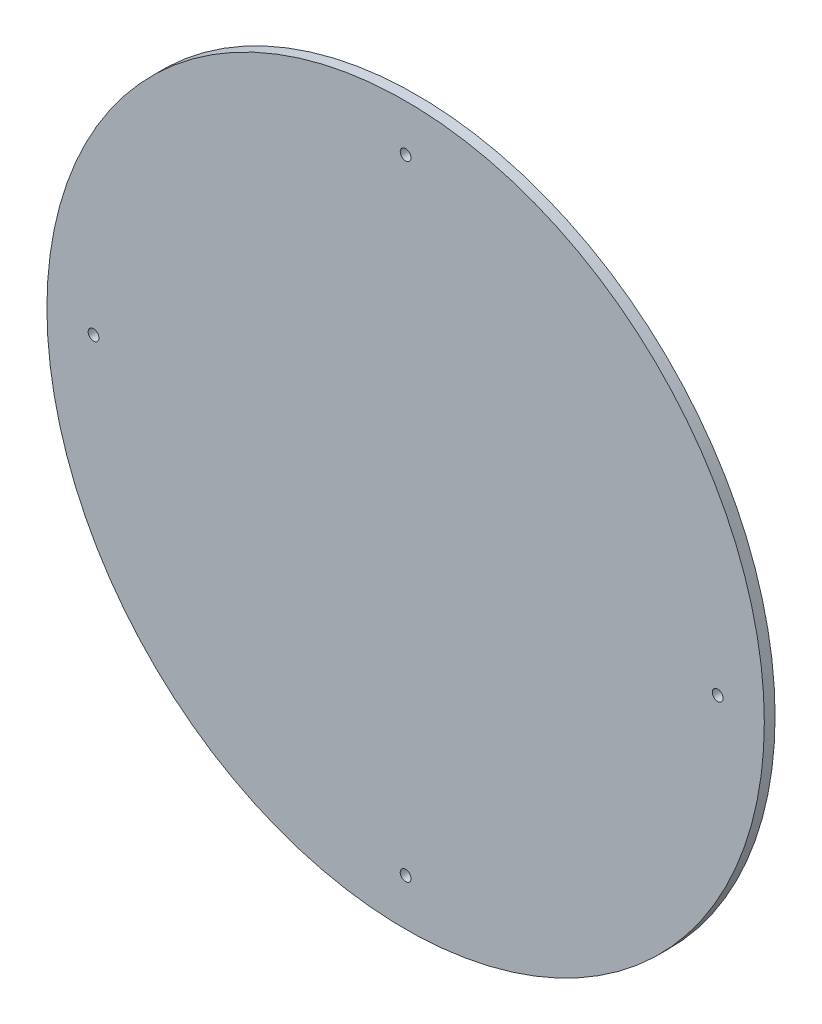
ISO-10303-21;
HEADER;
FILE_DESCRIPTION(('STEP AP214'),'2;1');
FILE_NAME('part.step','',(''),(''),'','','');
FILE_SCHEMA(('AUTOMOTIVE_DESIGN { 1 0 10303 214 1 1 1 1 }'));
ENDSEC;
DATA;
#1=APPLICATION_CONTEXT('core data for automotive mechanical design processes');
#2=APPLICATION_PROTOCOL_DEFINITION('international standard','automotive_design',2000,#1);
#3=PRODUCT_CONTEXT('',#1,'mechanical');
#4=PRODUCT('Part','Part','',(#3));
#5=PRODUCT_RELATED_PRODUCT_CATEGORY('part','',(#4));
#6=PRODUCT_DEFINITION_FORMATION('','',#4);
#7=PRODUCT_DEFINITION_CONTEXT('part definition',#1,'design');
#8=PRODUCT_DEFINITION('design','',#6,#7);
#9=PRODUCT_DEFINITION_SHAPE('','',#8);
#10=(LENGTH_UNIT() NAMED_UNIT(*) SI_UNIT(.MILLI.,.METRE.));
#11=(NAMED_UNIT(*) PLANE_ANGLE_UNIT() SI_UNIT($,.RADIAN.));
#12=(NAMED_UNIT(*) SI_UNIT($,.STERADIAN.) SOLID_ANGLE_UNIT());
#13=UNCERTAINTY_MEASURE_WITH_UNIT(LENGTH_MEASURE(1.E-05),#10,'distance_accuracy_value','');
#14=(GEOMETRIC_REPRESENTATION_CONTEXT(3) GLOBAL_UNCERTAINTY_ASSIGNED_CONTEXT((#13)) GLOBAL_UNIT_ASSIGNED_CONTEXT((#10,
#11,#12)) REPRESENTATION_CONTEXT('',''));
#15=CARTESIAN_POINT('',(0.,0.,0.));
#16=DIRECTION('',(0.,0.,1.));
#17=DIRECTION('',(1.,0.,0.));
#18=AXIS2_PLACEMENT_3D('',#15,#16,#17);
#19=CARTESIAN_POINT('',(0.,0.,3.));
#20=DIRECTION('',(0.,0.,-1.));
#21=DIRECTION('',(-1.,0.,0.));
#22=AXIS2_PLACEMENT_3D('',#19,#20,#21);
#23=CYLINDRICAL_SURFACE('',#22,100.);
#24=CARTESIAN_POINT('',(0.,0.,3.));
#25=DIRECTION('',(0.,0.,1.));
#26=DIRECTION('',(1.,0.,0.));
#27=AXIS2_PLACEMENT_3D('',#24,#25,#26);
#28=CIRCLE('',#27,100.);
#29=CARTESIAN_POINT('',(100.,0.,3.));
#30=VERTEX_POINT('',#29);
#31=EDGE_CURVE('E10',#30,#30,#28,.T.);
#32=ORIENTED_EDGE('',*,*,#31,.F.);
#33=EDGE_LOOP('',(#32));
#34=FACE_BOUND('',#33,.T.);
#35=CARTESIAN_POINT('',(0.,0.,0.));
#36=DIRECTION('',(0.,0.,1.));
#37=DIRECTION('',(1.,0.,0.));
#38=AXIS2_PLACEMENT_3D('',#35,#36,#37);
#39=CIRCLE('',#38,100.);
#40=CARTESIAN_POINT('',(100.,0.,0.));
#41=VERTEX_POINT('',#40);
#42=EDGE_CURVE('E40',#41,#41,#39,.T.);
#43=ORIENTED_EDGE('',*,*,#42,.T.);
#44=EDGE_LOOP('',(#43));
#45=FACE_BOUND('',#44,.T.);
#46=ADVANCED_FACE('F37',(#34,#45),#23,.T.);
#47=CARTESIAN_POINT('',(0.,0.,3.));
#48=DIRECTION('',(0.,0.,1.));
#49=DIRECTION('',(1.,0.,0.));
#50=AXIS2_PLACEMENT_3D('',#47,#48,#49);
#51=PLANE('',#50);
#52=CARTESIAN_POINT('',(0.,87.,3.));
#53=DIRECTION('',(0.,0.,1.));
#54=DIRECTION('',(1.,0.,0.));
#55=AXIS2_PLACEMENT_3D('',#52,#53,#54);
#56=CIRCLE('',#55,1.5);
#57=CARTESIAN_POINT('',(1.5,87.,3.));
#58=VERTEX_POINT('',#57);
#59=EDGE_CURVE('E72',#58,#58,#56,.T.);
#60=ORIENTED_EDGE('',*,*,#59,.F.);
#61=EDGE_LOOP('',(#60));
#62=FACE_BOUND('',#61,.T.);
#63=CARTESIAN_POINT('',(87.,0.,3.));
#64=DIRECTION('',(0.,0.,1.));
#65=DIRECTION('',(1.,0.,0.));
#66=AXIS2_PLACEMENT_3D('',#63,#64,#65);
#67=CIRCLE('',#66,1.50000000000029);
#68=CARTESIAN_POINT('',(88.5000000000003,0.,3.));
#69=VERTEX_POINT('',#68);
#70=EDGE_CURVE('E64',#69,#69,#67,.T.);
#71=ORIENTED_EDGE('',*,*,#70,.F.);
#72=EDGE_LOOP('',(#71));
#73=FACE_BOUND('',#72,.T.);
#74=CARTESIAN_POINT('',(0.,-87.,3.));
#75=DIRECTION('',(0.,0.,1.));
#76=DIRECTION('',(1.,0.,0.));
#77=AXIS2_PLACEMENT_3D('',#74,#75,#76);
#78=CIRCLE('',#77,1.50000000000057);
#79=CARTESIAN_POINT('',(1.50000000000056,-87.,3.));
#80=VERTEX_POINT('',#79);
#81=EDGE_CURVE('E55',#80,#80,#78,.T.);
#82=ORIENTED_EDGE('',*,*,#81,.F.);
#83=EDGE_LOOP('',(#82));
#84=FACE_BOUND('',#83,.T.);
#85=CARTESIAN_POINT('',(-87.,0.,3.));
#86=DIRECTION('',(0.,0.,1.));
#87=DIRECTION('',(1.,0.,0.));
#88=AXIS2_PLACEMENT_3D('',#85,#86,#87);
#89=CIRCLE('',#88,1.50000000000088);
#90=CARTESIAN_POINT('',(-85.4999999999991,0.,3.));
#91=VERTEX_POINT('',#90);
#92=EDGE_CURVE('E56',#91,#91,#89,.T.);
#93=ORIENTED_EDGE('',*,*,#92,.F.);
#94=EDGE_LOOP('',(#93));
#95=FACE_BOUND('',#94,.T.);
#96=ORIENTED_EDGE('',*,*,#31,.T.);
#97=EDGE_LOOP('',(#96));
#98=FACE_BOUND('',#97,.T.);
#99=ADVANCED_FACE('F85',(#62,#73,#84,#95,#98),#51,.T.);
#100=CARTESIAN_POINT('',(0.,0.,0.));
#101=DIRECTION('',(0.,0.,1.));
#102=DIRECTION('',(1.,0.,0.));
#103=AXIS2_PLACEMENT_3D('',#100,#101,#102);
#104=PLANE('',#103);
#105=CARTESIAN_POINT('',(0.,87.,0.));
#106=DIRECTION('',(0.,0.,1.));
#107=DIRECTION('',(1.,0.,0.));
#108=AXIS2_PLACEMENT_3D('',#105,#106,#107);
#109=CIRCLE('',#108,1.5);
#110=CARTESIAN_POINT('',(1.5,87.,0.));
#111=VERTEX_POINT('',#110);
#112=EDGE_CURVE('E49',#111,#111,#109,.F.);
#113=ORIENTED_EDGE('',*,*,#112,.F.);
#114=EDGE_LOOP('',(#113));
#115=FACE_BOUND('',#114,.T.);
#116=CARTESIAN_POINT('',(87.,0.,0.));
#117=DIRECTION('',(0.,0.,1.));
#118=DIRECTION('',(1.,0.,0.));
#119=AXIS2_PLACEMENT_3D('',#116,#117,#118);
#120=CIRCLE('',#119,1.50000000000029);
#121=CARTESIAN_POINT('',(88.5000000000003,0.,0.));
#122=VERTEX_POINT('',#121);
#123=EDGE_CURVE('E68',#122,#122,#120,.F.);
#124=ORIENTED_EDGE('',*,*,#123,.F.);
#125=EDGE_LOOP('',(#124));
#126=FACE_BOUND('',#125,.T.);
#127=CARTESIAN_POINT('',(0.,-87.,0.));
#128=DIRECTION('',(0.,0.,1.));
#129=DIRECTION('',(1.,0.,0.));
#130=AXIS2_PLACEMENT_3D('',#127,#128,#129);
#131=CIRCLE('',#130,1.50000000000057);
#132=CARTESIAN_POINT('',(1.50000000000056,-87.,0.));
#133=VERTEX_POINT('',#132);
#134=EDGE_CURVE('E60',#133,#133,#131,.F.);
#135=ORIENTED_EDGE('',*,*,#134,.F.);
#136=EDGE_LOOP('',(#135));
#137=FACE_BOUND('',#136,.T.);
#138=CARTESIAN_POINT('',(-87.,0.,0.));
#139=DIRECTION('',(0.,0.,1.));
#140=DIRECTION('',(1.,0.,0.));
#141=AXIS2_PLACEMENT_3D('',#138,#139,#140);
#142=CIRCLE('',#141,1.50000000000088);
#143=CARTESIAN_POINT('',(-85.4999999999991,0.,0.));
#144=VERTEX_POINT('',#143);
#145=EDGE_CURVE('E51',#144,#144,#142,.F.);
#146=ORIENTED_EDGE('',*,*,#145,.F.);
#147=EDGE_LOOP('',(#146));
#148=FACE_BOUND('',#147,.T.);
#149=ORIENTED_EDGE('',*,*,#42,.F.);
#150=EDGE_LOOP('',(#149));
#151=FACE_BOUND('',#150,.T.);
#152=ADVANCED_FACE('F88',(#115,#126,#137,#148,#151),#104,.F.);
#153=CARTESIAN_POINT('',(-87.,0.,-4.24264068712176));
#154=DIRECTION('',(0.,0.,1.));
#155=DIRECTION('',(1.,0.,0.));
#156=AXIS2_PLACEMENT_3D('',#153,#154,#155);
#157=CYLINDRICAL_SURFACE('',#156,1.50000000000088);
#158=ORIENTED_EDGE('',*,*,#145,.T.);
#159=EDGE_LOOP('',(#158));
#160=FACE_BOUND('',#159,.T.);
#161=ORIENTED_EDGE('',*,*,#92,.T.);
#162=EDGE_LOOP('',(#161));
#163=FACE_BOUND('',#162,.T.);
#164=ADVANCED_FACE('F96',(#160,#163),#157,.F.);
#165=CARTESIAN_POINT('',(0.,-87.,-4.24264068712176));
#166=DIRECTION('',(0.,0.,1.));
#167=DIRECTION('',(1.,0.,0.));
#168=AXIS2_PLACEMENT_3D('',#165,#166,#167);
#169=CYLINDRICAL_SURFACE('',#168,1.50000000000057);
#170=ORIENTED_EDGE('',*,*,#134,.T.);
#171=EDGE_LOOP('',(#170));
#172=FACE_BOUND('',#171,.T.);
#173=ORIENTED_EDGE('',*,*,#81,.T.);
#174=EDGE_LOOP('',(#173));
#175=FACE_BOUND('',#174,.T.);
#176=ADVANCED_FACE('F98',(#172,#175),#169,.F.);
#177=CARTESIAN_POINT('',(87.,0.,-4.24264068712176));
#178=DIRECTION('',(0.,0.,1.));
#179=DIRECTION('',(1.,0.,0.));
#180=AXIS2_PLACEMENT_3D('',#177,#178,#179);
#181=CYLINDRICAL_SURFACE('',#180,1.50000000000029);
#182=ORIENTED_EDGE('',*,*,#123,.T.);
#183=EDGE_LOOP('',(#182));
#184=FACE_BOUND('',#183,.T.);
#185=ORIENTED_EDGE('',*,*,#70,.T.);
#186=EDGE_LOOP('',(#185));
#187=FACE_BOUND('',#186,.T.);
#188=ADVANCED_FACE('F105',(#184,#187),#181,.F.);
#189=CARTESIAN_POINT('',(0.,87.,-4.24264068712176));
#190=DIRECTION('',(0.,0.,1.));
#191=DIRECTION('',(1.,0.,0.));
#192=AXIS2_PLACEMENT_3D('',#189,#190,#191);
#193=CYLINDRICAL_SURFACE('',#192,1.5);
#194=ORIENTED_EDGE('',*,*,#112,.T.);
#195=EDGE_LOOP('',(#194));
#196=FACE_BOUND('',#195,.T.);
#197=ORIENTED_EDGE('',*,*,#59,.T.);
#198=EDGE_LOOP('',(#197));
#199=FACE_BOUND('',#198,.T.);
#200=ADVANCED_FACE('F83',(#196,#199),#193,.F.);
#201=CLOSED_SHELL('',(#46,#99,#152,#164,#176,#188,#200));
#202=MANIFOLD_SOLID_BREP('B2',#201);
#203=ADVANCED_BREP_SHAPE_REPRESENTATION('',(#18,#202),#14);
#204=SHAPE_DEFINITION_REPRESENTATION(#9,#203);
ENDSEC;
END-ISO-10303-21;
